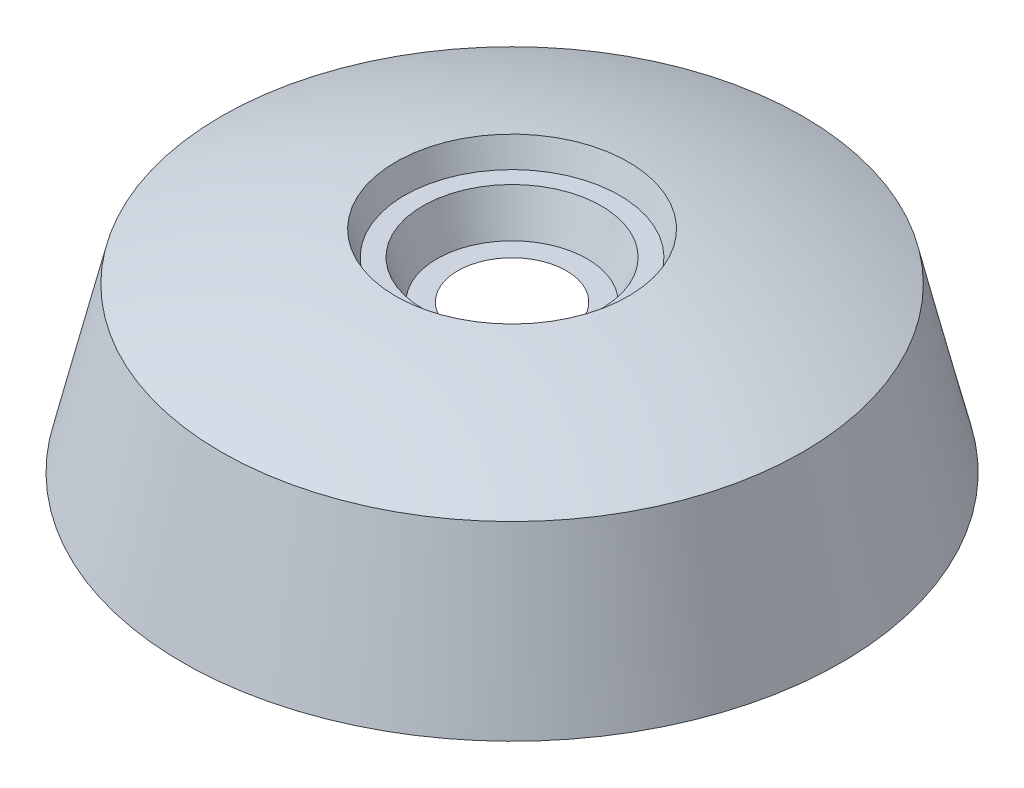
ISO-10303-21;
HEADER;
FILE_DESCRIPTION(('STEP AP214'),'2;1');
FILE_NAME('part.step','',(''),(''),'','','');
FILE_SCHEMA(('AUTOMOTIVE_DESIGN { 1 0 10303 214 1 1 1 1 }'));
ENDSEC;
DATA;
#1=APPLICATION_CONTEXT('core data for automotive mechanical design processes');
#2=APPLICATION_PROTOCOL_DEFINITION('international standard','automotive_design',2000,#1);
#3=PRODUCT_CONTEXT('',#1,'mechanical');
#4=PRODUCT('Part','Part','',(#3));
#5=PRODUCT_RELATED_PRODUCT_CATEGORY('part','',(#4));
#6=PRODUCT_DEFINITION_FORMATION('','',#4);
#7=PRODUCT_DEFINITION_CONTEXT('part definition',#1,'design');
#8=PRODUCT_DEFINITION('design','',#6,#7);
#9=PRODUCT_DEFINITION_SHAPE('','',#8);
#10=(LENGTH_UNIT() NAMED_UNIT(*) SI_UNIT(.MILLI.,.METRE.));
#11=(NAMED_UNIT(*) PLANE_ANGLE_UNIT() SI_UNIT($,.RADIAN.));
#12=(NAMED_UNIT(*) SI_UNIT($,.STERADIAN.) SOLID_ANGLE_UNIT());
#13=UNCERTAINTY_MEASURE_WITH_UNIT(LENGTH_MEASURE(1.E-05),#10,'distance_accuracy_value','');
#14=(GEOMETRIC_REPRESENTATION_CONTEXT(3) GLOBAL_UNCERTAINTY_ASSIGNED_CONTEXT((#13)) GLOBAL_UNIT_ASSIGNED_CONTEXT((#10,
#11,#12)) REPRESENTATION_CONTEXT('',''));
#15=CARTESIAN_POINT('',(0.,0.,0.));
#16=DIRECTION('',(0.,0.,1.));
#17=DIRECTION('',(1.,0.,0.));
#18=AXIS2_PLACEMENT_3D('',#15,#16,#17);
#19=CARTESIAN_POINT('',(0.,0.,0.));
#20=DIRECTION('',(0.,-1.,0.));
#21=DIRECTION('',(0.,0.,-1.));
#22=AXIS2_PLACEMENT_3D('',#19,#20,#21);
#23=CONICAL_SURFACE('',#22,42.5,1.07937808120067);
#24=CARTESIAN_POINT('',(0.,19.,0.));
#25=DIRECTION('',(0.,1.,0.));
#26=DIRECTION('',(0.,0.,1.));
#27=AXIS2_PLACEMENT_3D('',#24,#25,#26);
#28=CIRCLE('',#27,7.);
#29=CARTESIAN_POINT('',(0.,19.,-7.00000000000001));
#30=VERTEX_POINT('',#29);
#31=EDGE_CURVE('E10',#30,#30,#28,.T.);
#32=CARTESIAN_POINT('',(0.,0.,0.));
#33=DIRECTION('',(0.,1.,0.));
#34=DIRECTION('',(0.,0.,1.));
#35=AXIS2_PLACEMENT_3D('',#32,#33,#34);
#36=CIRCLE('',#35,42.5);
#37=CARTESIAN_POINT('',(0.,0.,-42.5));
#38=VERTEX_POINT('',#37);
#39=EDGE_CURVE('E56',#38,#38,#36,.T.);
#40=CARTESIAN_POINT('',(0.,19.,-7.00000000000001));
#41=CARTESIAN_POINT('',(0.,18.8020833333333,-7.36979166666668));
#42=CARTESIAN_POINT('',(0.,18.6041666666667,-7.73958333333334));
#43=CARTESIAN_POINT('',(0.,18.2083333333333,-8.47916666666668));
#44=CARTESIAN_POINT('',(0.,18.0104166666667,-8.84895833333334));
#45=CARTESIAN_POINT('',(0.,17.6145833333333,-9.58854166666668));
#46=CARTESIAN_POINT('',(0.,17.4166666666667,-9.95833333333334));
#47=CARTESIAN_POINT('',(0.,17.0208333333333,-10.6979166666667));
#48=CARTESIAN_POINT('',(0.,16.8229166666667,-11.0677083333333));
#49=CARTESIAN_POINT('',(0.,16.4270833333333,-11.8072916666667));
#50=CARTESIAN_POINT('',(0.,16.2291666666667,-12.1770833333333));
#51=CARTESIAN_POINT('',(0.,15.8333333333333,-12.9166666666667));
#52=CARTESIAN_POINT('',(0.,15.6354166666667,-13.2864583333333));
#53=CARTESIAN_POINT('',(0.,15.2395833333333,-14.0260416666667));
#54=CARTESIAN_POINT('',(0.,15.0416666666667,-14.3958333333333));
#55=CARTESIAN_POINT('',(0.,14.6458333333333,-15.1354166666667));
#56=CARTESIAN_POINT('',(0.,14.4479166666667,-15.5052083333333));
#57=CARTESIAN_POINT('',(0.,14.0520833333333,-16.2447916666667));
#58=CARTESIAN_POINT('',(0.,13.8541666666667,-16.6145833333333));
#59=CARTESIAN_POINT('',(0.,13.4583333333333,-17.3541666666667));
#60=CARTESIAN_POINT('',(0.,13.2604166666667,-17.7239583333333));
#61=CARTESIAN_POINT('',(0.,12.8645833333333,-18.4635416666667));
#62=CARTESIAN_POINT('',(0.,12.6666666666667,-18.8333333333333));
#63=CARTESIAN_POINT('',(0.,12.2708333333333,-19.5729166666667));
#64=CARTESIAN_POINT('',(0.,12.0729166666667,-19.9427083333333));
#65=CARTESIAN_POINT('',(0.,11.6770833333333,-20.6822916666667));
#66=CARTESIAN_POINT('',(0.,11.4791666666667,-21.0520833333333));
#67=CARTESIAN_POINT('',(0.,11.0833333333333,-21.7916666666667));
#68=CARTESIAN_POINT('',(0.,10.8854166666667,-22.1614583333333));
#69=CARTESIAN_POINT('',(0.,10.4895833333333,-22.9010416666667));
#70=CARTESIAN_POINT('',(0.,10.2916666666667,-23.2708333333333));
#71=CARTESIAN_POINT('',(0.,9.89583333333333,-24.0104166666667));
#72=CARTESIAN_POINT('',(0.,9.69791666666666,-24.3802083333333));
#73=CARTESIAN_POINT('',(0.,9.30208333333332,-25.1197916666667));
#74=CARTESIAN_POINT('',(0.,9.10416666666666,-25.4895833333333));
#75=CARTESIAN_POINT('',(0.,8.70833333333333,-26.2291666666667));
#76=CARTESIAN_POINT('',(0.,8.51041666666666,-26.5989583333333));
#77=CARTESIAN_POINT('',(0.,8.11458333333333,-27.3385416666667));
#78=CARTESIAN_POINT('',(0.,7.91666666666666,-27.7083333333333));
#79=CARTESIAN_POINT('',(0.,7.52083333333333,-28.4479166666667));
#80=CARTESIAN_POINT('',(0.,7.32291666666666,-28.8177083333333));
#81=CARTESIAN_POINT('',(0.,6.92708333333333,-29.5572916666667));
#82=CARTESIAN_POINT('',(0.,6.72916666666666,-29.9270833333333));
#83=CARTESIAN_POINT('',(0.,6.33333333333332,-30.6666666666667));
#84=CARTESIAN_POINT('',(0.,6.13541666666666,-31.0364583333333));
#85=CARTESIAN_POINT('',(0.,5.73958333333333,-31.7760416666667));
#86=CARTESIAN_POINT('',(0.,5.54166666666666,-32.1458333333333));
#87=CARTESIAN_POINT('',(0.,5.14583333333333,-32.8854166666667));
#88=CARTESIAN_POINT('',(0.,4.94791666666666,-33.2552083333333));
#89=CARTESIAN_POINT('',(0.,4.55208333333333,-33.9947916666667));
#90=CARTESIAN_POINT('',(0.,4.35416666666666,-34.3645833333333));
#91=CARTESIAN_POINT('',(0.,3.95833333333333,-35.1041666666667));
#92=CARTESIAN_POINT('',(0.,3.76041666666666,-35.4739583333333));
#93=CARTESIAN_POINT('',(0.,3.36458333333333,-36.2135416666667));
#94=CARTESIAN_POINT('',(0.,3.16666666666666,-36.5833333333333));
#95=CARTESIAN_POINT('',(0.,2.77083333333333,-37.3229166666667));
#96=CARTESIAN_POINT('',(0.,2.57291666666666,-37.6927083333333));
#97=CARTESIAN_POINT('',(0.,2.17708333333332,-38.4322916666667));
#98=CARTESIAN_POINT('',(0.,1.97916666666666,-38.8020833333333));
#99=CARTESIAN_POINT('',(0.,1.58333333333333,-39.5416666666667));
#100=CARTESIAN_POINT('',(0.,1.38541666666666,-39.9114583333333));
#101=CARTESIAN_POINT('',(0.,0.989583333333328,-40.6510416666667));
#102=CARTESIAN_POINT('',(0.,0.79166666666666,-41.0208333333333));
#103=CARTESIAN_POINT('',(0.,0.395833333333326,-41.7604166666667));
#104=CARTESIAN_POINT('',(0.,0.197916666666659,-42.1302083333333));
#105=CARTESIAN_POINT('',(0.,0.,-42.5));
#106=B_SPLINE_CURVE_WITH_KNOTS('',3,(#40,#41,#42,#43,#44,#45,#46,#47,#48,#49,#50,#51,#52,#53,
#54,#55,#56,#57,#58,#59,#60,#61,#62,#63,#64,#65,#66,#67,#68,#69,#70,#71,#72,#73,#74,#75,#76,#77,
#78,#79,#80,#81,#82,#83,#84,#85,#86,#87,#88,#89,#90,#91,#92,#93,#94,#95,#96,#97,#98,#99,#100,
#101,#102,#103,#104,#105),.UNSPECIFIED.,.F.,.F.,(4,2,2,2,2,2,2,2,2,2,2,2,2,2,2,2,2,2,2,2,2,2,2,
2,2,2,2,2,2,2,2,2,4),(0.,1.25827340158051,2.51654680316103,3.77482020474154,5.03309360632205,
6.29136700790257,7.54964040948308,8.8079138110636,10.0661872126441,11.3244606142246,
12.5827340158051,13.8410074173857,15.0992808189662,16.3575542205467,17.6158276221272,
18.8741010237077,20.1323744252882,21.3906478268688,22.6489212284493,23.9071946300298,
25.1654680316103,26.4237414331908,27.6820148347713,28.9402882363518,30.1985616379324,
31.4568350395129,32.7151084410934,33.9733818426739,35.2316552442544,36.4899286458349,
37.7482020474154,39.0064754489959,40.2647488505765),.UNSPECIFIED.);
#107=EDGE_CURVE('BSEAM31',#30,#38,#106,.T.);
#108=ORIENTED_EDGE('',*,*,#31,.T.);
#109=ORIENTED_EDGE('',*,*,#39,.F.);
#110=ORIENTED_EDGE('',*,*,#107,.T.);
#111=ORIENTED_EDGE('',*,*,#107,.F.);
#112=EDGE_LOOP('',(#108,#110,#109,#111));
#113=FACE_BOUND('',#112,.T.);
#114=ADVANCED_FACE('F31',(#113),#23,.F.);
#115=CARTESIAN_POINT('',(-7.,19.,0.));
#116=DIRECTION('',(0.,1.,0.));
#117=DIRECTION('',(0.,0.,1.));
#118=AXIS2_PLACEMENT_3D('',#115,#116,#117);
#119=PLANE('',#118);
#120=CARTESIAN_POINT('',(0.,19.,0.));
#121=DIRECTION('',(0.,1.,0.));
#122=DIRECTION('',(0.,0.,1.));
#123=AXIS2_PLACEMENT_3D('',#120,#121,#122);
#124=CIRCLE('',#123,9.68014882866902);
#125=CARTESIAN_POINT('',(0.,19.,9.68014882866902));
#126=VERTEX_POINT('',#125);
#127=EDGE_CURVE('E37',#126,#126,#124,.T.);
#128=ORIENTED_EDGE('',*,*,#127,.T.);
#129=EDGE_LOOP('',(#128));
#130=FACE_BOUND('',#129,.T.);
#131=ORIENTED_EDGE('',*,*,#31,.F.);
#132=EDGE_LOOP('',(#131));
#133=FACE_BOUND('',#132,.T.);
#134=ADVANCED_FACE('F64',(#130,#133),#119,.T.);
#135=CARTESIAN_POINT('',(0.,19.,0.));
#136=DIRECTION('',(0.,1.,0.));
#137=DIRECTION('',(0.,0.,1.));
#138=AXIS2_PLACEMENT_3D('',#135,#136,#137);
#139=CONICAL_SURFACE('',#138,9.68014882866902,0.34906585039886);
#140=CARTESIAN_POINT('',(0.,24.,0.));
#141=DIRECTION('',(0.,1.,0.));
#142=DIRECTION('',(0.,0.,1.));
#143=AXIS2_PLACEMENT_3D('',#140,#141,#142);
#144=CIRCLE('',#143,11.5);
#145=CARTESIAN_POINT('',(0.,24.,11.5));
#146=VERTEX_POINT('',#145);
#147=EDGE_CURVE('E41',#146,#146,#144,.T.);
#148=ORIENTED_EDGE('',*,*,#147,.T.);
#149=EDGE_LOOP('',(#148));
#150=FACE_BOUND('',#149,.T.);
#151=ORIENTED_EDGE('',*,*,#127,.F.);
#152=EDGE_LOOP('',(#151));
#153=FACE_BOUND('',#152,.T.);
#154=ADVANCED_FACE('F68',(#150,#153),#139,.F.);
#155=CARTESIAN_POINT('',(-11.5,24.,0.));
#156=DIRECTION('',(0.,1.,0.));
#157=DIRECTION('',(0.,0.,1.));
#158=AXIS2_PLACEMENT_3D('',#155,#156,#157);
#159=PLANE('',#158);
#160=CARTESIAN_POINT('',(0.,24.,0.));
#161=DIRECTION('',(0.,1.,0.));
#162=DIRECTION('',(0.,0.,1.));
#163=AXIS2_PLACEMENT_3D('',#160,#161,#162);
#164=CIRCLE('',#163,13.8526535172617);
#165=CARTESIAN_POINT('',(0.,24.,13.8526535172617));
#166=VERTEX_POINT('',#165);
#167=EDGE_CURVE('E45',#166,#166,#164,.T.);
#168=ORIENTED_EDGE('',*,*,#167,.T.);
#169=EDGE_LOOP('',(#168));
#170=FACE_BOUND('',#169,.T.);
#171=ORIENTED_EDGE('',*,*,#147,.F.);
#172=EDGE_LOOP('',(#171));
#173=FACE_BOUND('',#172,.T.);
#174=ADVANCED_FACE('F72',(#170,#173),#159,.T.);
#175=CARTESIAN_POINT('',(0.,24.,0.));
#176=DIRECTION('',(0.,1.,0.));
#177=DIRECTION('',(0.,0.,1.));
#178=AXIS2_PLACEMENT_3D('',#175,#176,#177);
#179=CONICAL_SURFACE('',#178,13.8526535172617,0.349065850398859);
#180=CARTESIAN_POINT('',(0.,27.1523085536144,0.));
#181=DIRECTION('',(0.,1.,0.));
#182=DIRECTION('',(0.,0.,1.));
#183=AXIS2_PLACEMENT_3D('',#180,#181,#182);
#184=CIRCLE('',#183,15.);
#185=CARTESIAN_POINT('',(0.,27.1523085536144,15.));
#186=VERTEX_POINT('',#185);
#187=EDGE_CURVE('E50',#186,#186,#184,.T.);
#188=ORIENTED_EDGE('',*,*,#187,.T.);
#189=EDGE_LOOP('',(#188));
#190=FACE_BOUND('',#189,.T.);
#191=ORIENTED_EDGE('',*,*,#167,.F.);
#192=EDGE_LOOP('',(#191));
#193=FACE_BOUND('',#192,.T.);
#194=ADVANCED_FACE('F79',(#190,#193),#179,.F.);
#195=CARTESIAN_POINT('',(0.,-63.9501555927109,0.));
#196=DIRECTION('',(0.,1.,0.));
#197=DIRECTION('',(0.,0.,1.));
#198=AXIS2_PLACEMENT_3D('',#195,#196,#197);
#199=DEGENERATE_TOROIDAL_SURFACE('',#198,2.18044359318475,92.,.T.);
#200=CARTESIAN_POINT('',(0.,21.,0.));
#201=DIRECTION('',(0.,1.,0.));
#202=DIRECTION('',(0.,0.,1.));
#203=AXIS2_PLACEMENT_3D('',#200,#201,#202);
#204=CIRCLE('',#203,37.5);
#205=CARTESIAN_POINT('',(0.,21.,37.5));
#206=VERTEX_POINT('',#205);
#207=EDGE_CURVE('E53',#206,#206,#204,.T.);
#208=ORIENTED_EDGE('',*,*,#207,.T.);
#209=EDGE_LOOP('',(#208));
#210=FACE_BOUND('',#209,.T.);
#211=ORIENTED_EDGE('',*,*,#187,.F.);
#212=EDGE_LOOP('',(#211));
#213=FACE_BOUND('',#212,.T.);
#214=ADVANCED_FACE('F83',(#210,#213),#199,.T.);
#215=CARTESIAN_POINT('',(0.,21.,0.));
#216=DIRECTION('',(0.,-1.,0.));
#217=DIRECTION('',(0.,0.,-1.));
#218=AXIS2_PLACEMENT_3D('',#215,#216,#217);
#219=CONICAL_SURFACE('',#218,37.5,0.233743180868902);
#220=ORIENTED_EDGE('',*,*,#39,.T.);
#221=EDGE_LOOP('',(#220));
#222=FACE_BOUND('',#221,.T.);
#223=ORIENTED_EDGE('',*,*,#207,.F.);
#224=EDGE_LOOP('',(#223));
#225=FACE_BOUND('',#224,.T.);
#226=ADVANCED_FACE('F60',(#222,#225),#219,.T.);
#227=CLOSED_SHELL('',(#114,#134,#154,#174,#194,#214,#226));
#228=MANIFOLD_SOLID_BREP('B2',#227);
#229=ADVANCED_BREP_SHAPE_REPRESENTATION('',(#18,#228),#14);
#230=SHAPE_DEFINITION_REPRESENTATION(#9,#229);
ENDSEC;
END-ISO-10303-21;
